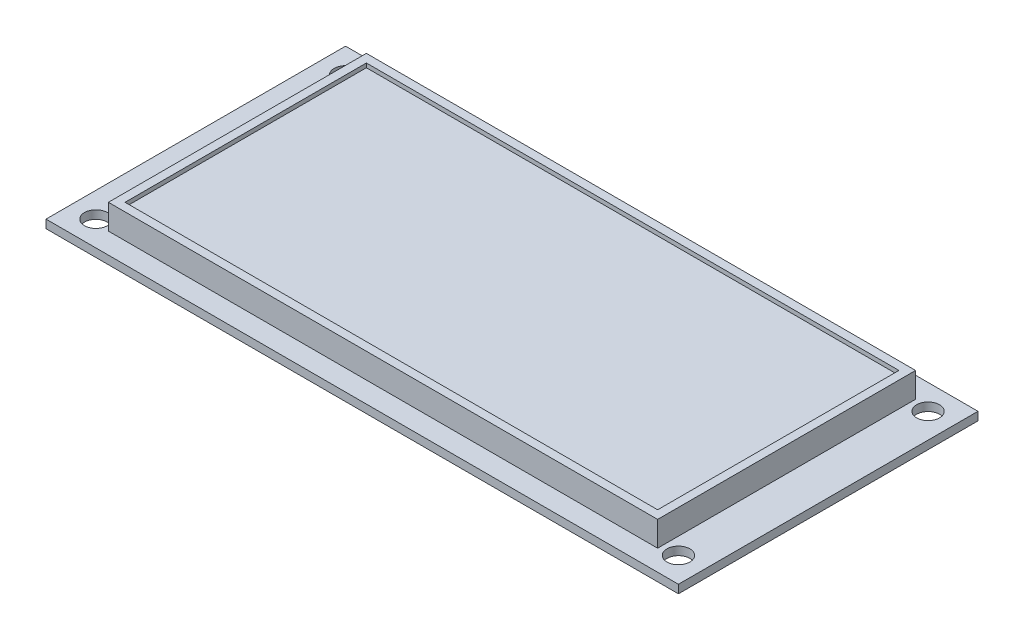
ISO-10303-21;
HEADER;
FILE_DESCRIPTION(('STEP AP214'),'2;1');
FILE_NAME('part.step','',(''),(''),'','','');
FILE_SCHEMA(('AUTOMOTIVE_DESIGN { 1 0 10303 214 1 1 1 1 }'));
ENDSEC;
DATA;
#1=APPLICATION_CONTEXT('core data for automotive mechanical design processes');
#2=APPLICATION_PROTOCOL_DEFINITION('international standard','automotive_design',2000,#1);
#3=PRODUCT_CONTEXT('',#1,'mechanical');
#4=PRODUCT('Part','Part','',(#3));
#5=PRODUCT_RELATED_PRODUCT_CATEGORY('part','',(#4));
#6=PRODUCT_DEFINITION_FORMATION('','',#4);
#7=PRODUCT_DEFINITION_CONTEXT('part definition',#1,'design');
#8=PRODUCT_DEFINITION('design','',#6,#7);
#9=PRODUCT_DEFINITION_SHAPE('','',#8);
#10=(LENGTH_UNIT() NAMED_UNIT(*) SI_UNIT(.MILLI.,.METRE.));
#11=(NAMED_UNIT(*) PLANE_ANGLE_UNIT() SI_UNIT($,.RADIAN.));
#12=(NAMED_UNIT(*) SI_UNIT($,.STERADIAN.) SOLID_ANGLE_UNIT());
#13=UNCERTAINTY_MEASURE_WITH_UNIT(LENGTH_MEASURE(1.E-05),#10,'distance_accuracy_value','');
#14=(GEOMETRIC_REPRESENTATION_CONTEXT(3) GLOBAL_UNCERTAINTY_ASSIGNED_CONTEXT((#13)) GLOBAL_UNIT_ASSIGNED_CONTEXT((#10,
#11,#12)) REPRESENTATION_CONTEXT('',''));
#15=CARTESIAN_POINT('',(0.,0.,0.));
#16=DIRECTION('',(0.,0.,1.));
#17=DIRECTION('',(1.,0.,0.));
#18=AXIS2_PLACEMENT_3D('',#15,#16,#17);
#19=CARTESIAN_POINT('',(0.,1.,0.));
#20=DIRECTION('',(0.,1.,0.));
#21=DIRECTION('',(0.,0.,1.));
#22=AXIS2_PLACEMENT_3D('',#19,#20,#21);
#23=PLANE('',#22);
#24=CARTESIAN_POINT('',(-35.,1.,15.));
#25=DIRECTION('',(0.,1.,0.));
#26=DIRECTION('',(0.,0.,1.));
#27=AXIS2_PLACEMENT_3D('',#24,#25,#26);
#28=CIRCLE('',#27,1.375);
#29=CARTESIAN_POINT('',(-35.,1.,16.375));
#30=VERTEX_POINT('',#29);
#31=EDGE_CURVE('E226',#30,#30,#28,.T.);
#32=ORIENTED_EDGE('',*,*,#31,.F.);
#33=EDGE_LOOP('',(#32));
#34=FACE_BOUND('',#33,.T.);
#35=CARTESIAN_POINT('',(35.,1.,15.));
#36=DIRECTION('',(0.,1.,0.));
#37=DIRECTION('',(0.,0.,-1.));
#38=AXIS2_PLACEMENT_3D('',#35,#36,#37);
#39=CIRCLE('',#38,1.375);
#40=CARTESIAN_POINT('',(35.,1.,13.625));
#41=VERTEX_POINT('',#40);
#42=EDGE_CURVE('E433',#41,#41,#39,.T.);
#43=ORIENTED_EDGE('',*,*,#42,.F.);
#44=EDGE_LOOP('',(#43));
#45=FACE_BOUND('',#44,.T.);
#46=CARTESIAN_POINT('',(35.,1.,-15.));
#47=DIRECTION('',(0.,1.,0.));
#48=DIRECTION('',(0.,0.,-1.));
#49=AXIS2_PLACEMENT_3D('',#46,#47,#48);
#50=CIRCLE('',#49,1.375);
#51=CARTESIAN_POINT('',(35.,1.,-16.375));
#52=VERTEX_POINT('',#51);
#53=EDGE_CURVE('E436',#52,#52,#50,.T.);
#54=ORIENTED_EDGE('',*,*,#53,.F.);
#55=EDGE_LOOP('',(#54));
#56=FACE_BOUND('',#55,.T.);
#57=CARTESIAN_POINT('',(-35.,1.,-15.));
#58=DIRECTION('',(0.,1.,0.));
#59=DIRECTION('',(0.,0.,1.));
#60=AXIS2_PLACEMENT_3D('',#57,#58,#59);
#61=CIRCLE('',#60,1.375);
#62=CARTESIAN_POINT('',(-35.,1.,-13.625));
#63=VERTEX_POINT('',#62);
#64=EDGE_CURVE('E152',#63,#63,#61,.T.);
#65=ORIENTED_EDGE('',*,*,#64,.F.);
#66=EDGE_LOOP('',(#65));
#67=FACE_BOUND('',#66,.T.);
#68=DIRECTION('',(0.,0.,-1.));
#69=VECTOR('',#68,1.);
#70=CARTESIAN_POINT('',(38.,1.,-18.));
#71=LINE('',#70,#69);
#72=CARTESIAN_POINT('',(38.,1.,18.));
#73=VERTEX_POINT('',#72);
#74=CARTESIAN_POINT('',(38.,1.,-18.));
#75=VERTEX_POINT('',#74);
#76=EDGE_CURVE('E196',#73,#75,#71,.T.);
#77=ORIENTED_EDGE('',*,*,#76,.T.);
#78=DIRECTION('',(-1.,0.,0.));
#79=VECTOR('',#78,1.);
#80=CARTESIAN_POINT('',(-38.,1.,-18.));
#81=LINE('',#80,#79);
#82=CARTESIAN_POINT('',(-38.,1.,-18.));
#83=VERTEX_POINT('',#82);
#84=EDGE_CURVE('E199',#75,#83,#81,.T.);
#85=ORIENTED_EDGE('',*,*,#84,.T.);
#86=DIRECTION('',(0.,0.,1.));
#87=VECTOR('',#86,1.);
#88=CARTESIAN_POINT('',(-38.,1.,-18.));
#89=LINE('',#88,#87);
#90=CARTESIAN_POINT('',(-38.,1.,18.));
#91=VERTEX_POINT('',#90);
#92=EDGE_CURVE('E202',#83,#91,#89,.T.);
#93=ORIENTED_EDGE('',*,*,#92,.T.);
#94=DIRECTION('',(1.,0.,0.));
#95=VECTOR('',#94,1.);
#96=CARTESIAN_POINT('',(-38.,1.,18.));
#97=LINE('',#96,#95);
#98=EDGE_CURVE('E204',#91,#73,#97,.T.);
#99=ORIENTED_EDGE('',*,*,#98,.T.);
#100=EDGE_LOOP('',(#77,#85,#93,#99));
#101=FACE_BOUND('',#100,.T.);
#102=DIRECTION('',(-1.,0.,0.));
#103=VECTOR('',#102,1.);
#104=CARTESIAN_POINT('',(-33.,1.,-15.5));
#105=LINE('',#104,#103);
#106=CARTESIAN_POINT('',(33.,1.,-15.5));
#107=VERTEX_POINT('',#106);
#108=CARTESIAN_POINT('',(-33.,1.,-15.5));
#109=VERTEX_POINT('',#108);
#110=EDGE_CURVE('E182',#107,#109,#105,.T.);
#111=ORIENTED_EDGE('',*,*,#110,.F.);
#112=DIRECTION('',(0.,0.,-1.));
#113=VECTOR('',#112,1.);
#114=CARTESIAN_POINT('',(33.,1.,-15.5));
#115=LINE('',#114,#113);
#116=CARTESIAN_POINT('',(33.,1.,15.5));
#117=VERTEX_POINT('',#116);
#118=EDGE_CURVE('E165',#117,#107,#115,.T.);
#119=ORIENTED_EDGE('',*,*,#118,.F.);
#120=DIRECTION('',(1.,0.,0.));
#121=VECTOR('',#120,1.);
#122=CARTESIAN_POINT('',(-33.,1.,15.5));
#123=LINE('',#122,#121);
#124=CARTESIAN_POINT('',(-33.,1.,15.5));
#125=VERTEX_POINT('',#124);
#126=EDGE_CURVE('E173',#125,#117,#123,.T.);
#127=ORIENTED_EDGE('',*,*,#126,.F.);
#128=DIRECTION('',(0.,0.,1.));
#129=VECTOR('',#128,1.);
#130=CARTESIAN_POINT('',(-33.,1.,-15.5));
#131=LINE('',#130,#129);
#132=EDGE_CURVE('E184',#109,#125,#131,.T.);
#133=ORIENTED_EDGE('',*,*,#132,.F.);
#134=EDGE_LOOP('',(#111,#119,#127,#133));
#135=FACE_BOUND('',#134,.T.);
#136=ADVANCED_FACE('F34',(#34,#45,#56,#67,#101,#135),#23,.T.);
#137=CARTESIAN_POINT('',(38.,1.,-18.));
#138=DIRECTION('',(-1.,0.,0.));
#139=DIRECTION('',(0.,0.,1.));
#140=AXIS2_PLACEMENT_3D('',#137,#138,#139);
#141=PLANE('',#140);
#142=DIRECTION('',(0.,0.,-1.));
#143=VECTOR('',#142,1.);
#144=CARTESIAN_POINT('',(38.,0.,-18.));
#145=LINE('',#144,#143);
#146=CARTESIAN_POINT('',(38.,0.,18.));
#147=VERTEX_POINT('',#146);
#148=CARTESIAN_POINT('',(38.,0.,-18.));
#149=VERTEX_POINT('',#148);
#150=EDGE_CURVE('E195',#147,#149,#145,.T.);
#151=ORIENTED_EDGE('',*,*,#150,.T.);
#152=DIRECTION('',(0.,-1.,0.));
#153=VECTOR('',#152,1.);
#154=CARTESIAN_POINT('',(38.,1.,-18.));
#155=LINE('',#154,#153);
#156=EDGE_CURVE('E11',#75,#149,#155,.T.);
#157=ORIENTED_EDGE('',*,*,#156,.F.);
#158=ORIENTED_EDGE('',*,*,#76,.F.);
#159=DIRECTION('',(0.,-1.,0.));
#160=VECTOR('',#159,1.);
#161=CARTESIAN_POINT('',(38.,1.,18.));
#162=LINE('',#161,#160);
#163=EDGE_CURVE('E206',#73,#147,#162,.T.);
#164=ORIENTED_EDGE('',*,*,#163,.T.);
#165=EDGE_LOOP('',(#151,#157,#158,#164));
#166=FACE_BOUND('',#165,.T.);
#167=ADVANCED_FACE('F36',(#166),#141,.F.);
#168=CARTESIAN_POINT('',(-38.,1.,-18.));
#169=DIRECTION('',(0.,0.,1.));
#170=DIRECTION('',(1.,0.,0.));
#171=AXIS2_PLACEMENT_3D('',#168,#169,#170);
#172=PLANE('',#171);
#173=DIRECTION('',(-1.,0.,0.));
#174=VECTOR('',#173,1.);
#175=CARTESIAN_POINT('',(-38.,0.,-18.));
#176=LINE('',#175,#174);
#177=CARTESIAN_POINT('',(-38.,0.,-18.));
#178=VERTEX_POINT('',#177);
#179=EDGE_CURVE('E209',#149,#178,#176,.T.);
#180=ORIENTED_EDGE('',*,*,#179,.T.);
#181=DIRECTION('',(0.,-1.,0.));
#182=VECTOR('',#181,1.);
#183=CARTESIAN_POINT('',(-38.,1.,-18.));
#184=LINE('',#183,#182);
#185=EDGE_CURVE('E43',#83,#178,#184,.T.);
#186=ORIENTED_EDGE('',*,*,#185,.F.);
#187=ORIENTED_EDGE('',*,*,#84,.F.);
#188=ORIENTED_EDGE('',*,*,#156,.T.);
#189=EDGE_LOOP('',(#180,#186,#187,#188));
#190=FACE_BOUND('',#189,.T.);
#191=ADVANCED_FACE('F288',(#190),#172,.F.);
#192=CARTESIAN_POINT('',(-38.,1.,-18.));
#193=DIRECTION('',(1.,0.,0.));
#194=DIRECTION('',(0.,0.,-1.));
#195=AXIS2_PLACEMENT_3D('',#192,#193,#194);
#196=PLANE('',#195);
#197=DIRECTION('',(0.,0.,1.));
#198=VECTOR('',#197,1.);
#199=CARTESIAN_POINT('',(-38.,0.,-18.));
#200=LINE('',#199,#198);
#201=CARTESIAN_POINT('',(-38.,0.,18.));
#202=VERTEX_POINT('',#201);
#203=EDGE_CURVE('E211',#178,#202,#200,.T.);
#204=ORIENTED_EDGE('',*,*,#203,.T.);
#205=DIRECTION('',(0.,-1.,0.));
#206=VECTOR('',#205,1.);
#207=CARTESIAN_POINT('',(-38.,1.,18.));
#208=LINE('',#207,#206);
#209=EDGE_CURVE('E216',#91,#202,#208,.T.);
#210=ORIENTED_EDGE('',*,*,#209,.F.);
#211=ORIENTED_EDGE('',*,*,#92,.F.);
#212=ORIENTED_EDGE('',*,*,#185,.T.);
#213=EDGE_LOOP('',(#204,#210,#211,#212));
#214=FACE_BOUND('',#213,.T.);
#215=ADVANCED_FACE('F285',(#214),#196,.F.);
#216=CARTESIAN_POINT('',(-38.,1.,18.));
#217=DIRECTION('',(0.,0.,-1.));
#218=DIRECTION('',(-1.,0.,0.));
#219=AXIS2_PLACEMENT_3D('',#216,#217,#218);
#220=PLANE('',#219);
#221=DIRECTION('',(1.,0.,0.));
#222=VECTOR('',#221,1.);
#223=CARTESIAN_POINT('',(-38.,0.,18.));
#224=LINE('',#223,#222);
#225=EDGE_CURVE('E200',#202,#147,#224,.T.);
#226=ORIENTED_EDGE('',*,*,#225,.T.);
#227=ORIENTED_EDGE('',*,*,#163,.F.);
#228=ORIENTED_EDGE('',*,*,#98,.F.);
#229=ORIENTED_EDGE('',*,*,#209,.T.);
#230=EDGE_LOOP('',(#226,#227,#228,#229));
#231=FACE_BOUND('',#230,.T.);
#232=ADVANCED_FACE('F282',(#231),#220,.F.);
#233=CARTESIAN_POINT('',(0.,0.,0.));
#234=DIRECTION('',(0.,1.,0.));
#235=DIRECTION('',(0.,0.,1.));
#236=AXIS2_PLACEMENT_3D('',#233,#234,#235);
#237=PLANE('',#236);
#238=CARTESIAN_POINT('',(-35.,0.,15.));
#239=DIRECTION('',(0.,1.,0.));
#240=DIRECTION('',(0.,0.,1.));
#241=AXIS2_PLACEMENT_3D('',#238,#239,#240);
#242=CIRCLE('',#241,1.375);
#243=CARTESIAN_POINT('',(-35.,0.,16.375));
#244=VERTEX_POINT('',#243);
#245=EDGE_CURVE('E38',#244,#244,#242,.T.);
#246=ORIENTED_EDGE('',*,*,#245,.T.);
#247=EDGE_LOOP('',(#246));
#248=FACE_BOUND('',#247,.T.);
#249=CARTESIAN_POINT('',(35.,0.,15.));
#250=DIRECTION('',(0.,1.,0.));
#251=DIRECTION('',(0.,0.,1.));
#252=AXIS2_PLACEMENT_3D('',#249,#250,#251);
#253=CIRCLE('',#252,1.375);
#254=CARTESIAN_POINT('',(35.,0.,16.375));
#255=VERTEX_POINT('',#254);
#256=EDGE_CURVE('E225',#255,#255,#253,.T.);
#257=ORIENTED_EDGE('',*,*,#256,.T.);
#258=EDGE_LOOP('',(#257));
#259=FACE_BOUND('',#258,.T.);
#260=CARTESIAN_POINT('',(35.,0.,-15.));
#261=DIRECTION('',(0.,1.,0.));
#262=DIRECTION('',(0.,0.,1.));
#263=AXIS2_PLACEMENT_3D('',#260,#261,#262);
#264=CIRCLE('',#263,1.375);
#265=CARTESIAN_POINT('',(35.,0.,-13.625));
#266=VERTEX_POINT('',#265);
#267=EDGE_CURVE('E223',#266,#266,#264,.T.);
#268=ORIENTED_EDGE('',*,*,#267,.T.);
#269=EDGE_LOOP('',(#268));
#270=FACE_BOUND('',#269,.T.);
#271=CARTESIAN_POINT('',(-35.,0.,-15.));
#272=DIRECTION('',(0.,1.,0.));
#273=DIRECTION('',(0.,0.,1.));
#274=AXIS2_PLACEMENT_3D('',#271,#272,#273);
#275=CIRCLE('',#274,1.375);
#276=CARTESIAN_POINT('',(-35.,0.,-13.625));
#277=VERTEX_POINT('',#276);
#278=EDGE_CURVE('E159',#277,#277,#275,.T.);
#279=ORIENTED_EDGE('',*,*,#278,.T.);
#280=EDGE_LOOP('',(#279));
#281=FACE_BOUND('',#280,.T.);
#282=ORIENTED_EDGE('',*,*,#150,.F.);
#283=ORIENTED_EDGE('',*,*,#225,.F.);
#284=ORIENTED_EDGE('',*,*,#203,.F.);
#285=ORIENTED_EDGE('',*,*,#179,.F.);
#286=EDGE_LOOP('',(#282,#283,#284,#285));
#287=FACE_BOUND('',#286,.T.);
#288=ADVANCED_FACE('F278',(#248,#259,#270,#281,#287),#237,.F.);
#289=CARTESIAN_POINT('',(33.,4.,-15.5));
#290=DIRECTION('',(-1.,0.,0.));
#291=DIRECTION('',(0.,0.,1.));
#292=AXIS2_PLACEMENT_3D('',#289,#290,#291);
#293=PLANE('',#292);
#294=ORIENTED_EDGE('',*,*,#118,.T.);
#295=DIRECTION('',(0.,-1.,0.));
#296=VECTOR('',#295,1.);
#297=CARTESIAN_POINT('',(33.,4.,-15.5));
#298=LINE('',#297,#296);
#299=CARTESIAN_POINT('',(33.,4.,-15.5));
#300=VERTEX_POINT('',#299);
#301=EDGE_CURVE('E193',#300,#107,#298,.T.);
#302=ORIENTED_EDGE('',*,*,#301,.F.);
#303=DIRECTION('',(0.,0.,-1.));
#304=VECTOR('',#303,1.);
#305=CARTESIAN_POINT('',(33.,4.,-15.5));
#306=LINE('',#305,#304);
#307=CARTESIAN_POINT('',(33.,4.,15.5));
#308=VERTEX_POINT('',#307);
#309=EDGE_CURVE('E169',#308,#300,#306,.T.);
#310=ORIENTED_EDGE('',*,*,#309,.F.);
#311=DIRECTION('',(0.,-1.,0.));
#312=VECTOR('',#311,1.);
#313=CARTESIAN_POINT('',(33.,4.,15.5));
#314=LINE('',#313,#312);
#315=EDGE_CURVE('E179',#308,#117,#314,.T.);
#316=ORIENTED_EDGE('',*,*,#315,.T.);
#317=EDGE_LOOP('',(#294,#302,#310,#316));
#318=FACE_BOUND('',#317,.T.);
#319=ADVANCED_FACE('F262',(#318),#293,.F.);
#320=CARTESIAN_POINT('',(-33.,4.,-15.5));
#321=DIRECTION('',(0.,0.,1.));
#322=DIRECTION('',(1.,0.,0.));
#323=AXIS2_PLACEMENT_3D('',#320,#321,#322);
#324=PLANE('',#323);
#325=ORIENTED_EDGE('',*,*,#110,.T.);
#326=DIRECTION('',(0.,-1.,0.));
#327=VECTOR('',#326,1.);
#328=CARTESIAN_POINT('',(-33.,4.,-15.5));
#329=LINE('',#328,#327);
#330=CARTESIAN_POINT('',(-33.,4.,-15.5));
#331=VERTEX_POINT('',#330);
#332=EDGE_CURVE('E190',#331,#109,#329,.T.);
#333=ORIENTED_EDGE('',*,*,#332,.F.);
#334=DIRECTION('',(-1.,0.,0.));
#335=VECTOR('',#334,1.);
#336=CARTESIAN_POINT('',(-33.,4.,-15.5));
#337=LINE('',#336,#335);
#338=EDGE_CURVE('E172',#300,#331,#337,.T.);
#339=ORIENTED_EDGE('',*,*,#338,.F.);
#340=ORIENTED_EDGE('',*,*,#301,.T.);
#341=EDGE_LOOP('',(#325,#333,#339,#340));
#342=FACE_BOUND('',#341,.T.);
#343=ADVANCED_FACE('F252',(#342),#324,.F.);
#344=CARTESIAN_POINT('',(-33.,4.,-15.5));
#345=DIRECTION('',(1.,0.,0.));
#346=DIRECTION('',(0.,0.,-1.));
#347=AXIS2_PLACEMENT_3D('',#344,#345,#346);
#348=PLANE('',#347);
#349=ORIENTED_EDGE('',*,*,#132,.T.);
#350=DIRECTION('',(0.,-1.,0.));
#351=VECTOR('',#350,1.);
#352=CARTESIAN_POINT('',(-33.,4.,15.5));
#353=LINE('',#352,#351);
#354=CARTESIAN_POINT('',(-33.,4.,15.5));
#355=VERTEX_POINT('',#354);
#356=EDGE_CURVE('E59',#355,#125,#353,.T.);
#357=ORIENTED_EDGE('',*,*,#356,.F.);
#358=DIRECTION('',(0.,0.,1.));
#359=VECTOR('',#358,1.);
#360=CARTESIAN_POINT('',(-33.,4.,-15.5));
#361=LINE('',#360,#359);
#362=EDGE_CURVE('E175',#331,#355,#361,.T.);
#363=ORIENTED_EDGE('',*,*,#362,.F.);
#364=ORIENTED_EDGE('',*,*,#332,.T.);
#365=EDGE_LOOP('',(#349,#357,#363,#364));
#366=FACE_BOUND('',#365,.T.);
#367=ADVANCED_FACE('F256',(#366),#348,.F.);
#368=CARTESIAN_POINT('',(-33.,4.,15.5));
#369=DIRECTION('',(0.,0.,-1.));
#370=DIRECTION('',(-1.,0.,0.));
#371=AXIS2_PLACEMENT_3D('',#368,#369,#370);
#372=PLANE('',#371);
#373=ORIENTED_EDGE('',*,*,#126,.T.);
#374=ORIENTED_EDGE('',*,*,#315,.F.);
#375=DIRECTION('',(1.,0.,0.));
#376=VECTOR('',#375,1.);
#377=CARTESIAN_POINT('',(-33.,4.,15.5));
#378=LINE('',#377,#376);
#379=EDGE_CURVE('E177',#355,#308,#378,.T.);
#380=ORIENTED_EDGE('',*,*,#379,.F.);
#381=ORIENTED_EDGE('',*,*,#356,.T.);
#382=EDGE_LOOP('',(#373,#374,#380,#381));
#383=FACE_BOUND('',#382,.T.);
#384=ADVANCED_FACE('F263',(#383),#372,.F.);
#385=CARTESIAN_POINT('',(0.,4.,0.));
#386=DIRECTION('',(0.,1.,0.));
#387=DIRECTION('',(0.,0.,1.));
#388=AXIS2_PLACEMENT_3D('',#385,#386,#387);
#389=PLANE('',#388);
#390=DIRECTION('',(0.,0.,-1.));
#391=VECTOR('',#390,1.);
#392=CARTESIAN_POINT('',(32.,4.,-14.5));
#393=LINE('',#392,#391);
#394=CARTESIAN_POINT('',(32.,4.,14.5));
#395=VERTEX_POINT('',#394);
#396=CARTESIAN_POINT('',(32.,4.,-14.5));
#397=VERTEX_POINT('',#396);
#398=EDGE_CURVE('E51',#395,#397,#393,.T.);
#399=ORIENTED_EDGE('',*,*,#398,.F.);
#400=DIRECTION('',(1.,0.,0.));
#401=VECTOR('',#400,1.);
#402=CARTESIAN_POINT('',(-32.,4.,14.5));
#403=LINE('',#402,#401);
#404=CARTESIAN_POINT('',(-32.,4.,14.5));
#405=VERTEX_POINT('',#404);
#406=EDGE_CURVE('E146',#405,#395,#403,.T.);
#407=ORIENTED_EDGE('',*,*,#406,.F.);
#408=DIRECTION('',(0.,0.,1.));
#409=VECTOR('',#408,1.);
#410=CARTESIAN_POINT('',(-32.,4.,-14.5));
#411=LINE('',#410,#409);
#412=CARTESIAN_POINT('',(-32.,4.,-14.5));
#413=VERTEX_POINT('',#412);
#414=EDGE_CURVE('E149',#413,#405,#411,.T.);
#415=ORIENTED_EDGE('',*,*,#414,.F.);
#416=DIRECTION('',(-1.,0.,0.));
#417=VECTOR('',#416,1.);
#418=CARTESIAN_POINT('',(-32.,4.,-14.5));
#419=LINE('',#418,#417);
#420=EDGE_CURVE('E158',#397,#413,#419,.T.);
#421=ORIENTED_EDGE('',*,*,#420,.F.);
#422=EDGE_LOOP('',(#399,#407,#415,#421));
#423=FACE_BOUND('',#422,.T.);
#424=ORIENTED_EDGE('',*,*,#309,.T.);
#425=ORIENTED_EDGE('',*,*,#338,.T.);
#426=ORIENTED_EDGE('',*,*,#362,.T.);
#427=ORIENTED_EDGE('',*,*,#379,.T.);
#428=EDGE_LOOP('',(#424,#425,#426,#427));
#429=FACE_BOUND('',#428,.T.);
#430=ADVANCED_FACE('F258',(#423,#429),#389,.T.);
#431=CARTESIAN_POINT('',(32.,3.5,-14.5));
#432=DIRECTION('',(1.,0.,0.));
#433=DIRECTION('',(0.,0.,-1.));
#434=AXIS2_PLACEMENT_3D('',#431,#432,#433);
#435=PLANE('',#434);
#436=ORIENTED_EDGE('',*,*,#398,.T.);
#437=DIRECTION('',(0.,1.,0.));
#438=VECTOR('',#437,1.);
#439=CARTESIAN_POINT('',(32.,3.5,-14.5));
#440=LINE('',#439,#438);
#441=CARTESIAN_POINT('',(32.,3.5,-14.5));
#442=VERTEX_POINT('',#441);
#443=EDGE_CURVE('E124',#442,#397,#440,.T.);
#444=ORIENTED_EDGE('',*,*,#443,.F.);
#445=DIRECTION('',(0.,0.,-1.));
#446=VECTOR('',#445,1.);
#447=CARTESIAN_POINT('',(32.,3.5,-14.5));
#448=LINE('',#447,#446);
#449=CARTESIAN_POINT('',(32.,3.5,14.5));
#450=VERTEX_POINT('',#449);
#451=EDGE_CURVE('E128',#450,#442,#448,.T.);
#452=ORIENTED_EDGE('',*,*,#451,.F.);
#453=DIRECTION('',(0.,1.,0.));
#454=VECTOR('',#453,1.);
#455=CARTESIAN_POINT('',(32.,3.5,14.5));
#456=LINE('',#455,#454);
#457=EDGE_CURVE('E163',#450,#395,#456,.T.);
#458=ORIENTED_EDGE('',*,*,#457,.T.);
#459=EDGE_LOOP('',(#436,#444,#452,#458));
#460=FACE_BOUND('',#459,.T.);
#461=ADVANCED_FACE('F126',(#460),#435,.F.);
#462=CARTESIAN_POINT('',(-32.,3.5,14.5));
#463=DIRECTION('',(0.,0.,1.));
#464=DIRECTION('',(1.,0.,0.));
#465=AXIS2_PLACEMENT_3D('',#462,#463,#464);
#466=PLANE('',#465);
#467=ORIENTED_EDGE('',*,*,#406,.T.);
#468=ORIENTED_EDGE('',*,*,#457,.F.);
#469=DIRECTION('',(1.,0.,0.));
#470=VECTOR('',#469,1.);
#471=CARTESIAN_POINT('',(-32.,3.5,14.5));
#472=LINE('',#471,#470);
#473=CARTESIAN_POINT('',(-32.,3.5,14.5));
#474=VERTEX_POINT('',#473);
#475=EDGE_CURVE('E134',#474,#450,#472,.T.);
#476=ORIENTED_EDGE('',*,*,#475,.F.);
#477=DIRECTION('',(0.,1.,0.));
#478=VECTOR('',#477,1.);
#479=CARTESIAN_POINT('',(-32.,3.5,14.5));
#480=LINE('',#479,#478);
#481=EDGE_CURVE('E166',#474,#405,#480,.T.);
#482=ORIENTED_EDGE('',*,*,#481,.T.);
#483=EDGE_LOOP('',(#467,#468,#476,#482));
#484=FACE_BOUND('',#483,.T.);
#485=ADVANCED_FACE('F357',(#484),#466,.F.);
#486=CARTESIAN_POINT('',(-32.,3.5,-14.5));
#487=DIRECTION('',(-1.,0.,0.));
#488=DIRECTION('',(0.,0.,1.));
#489=AXIS2_PLACEMENT_3D('',#486,#487,#488);
#490=PLANE('',#489);
#491=ORIENTED_EDGE('',*,*,#414,.T.);
#492=ORIENTED_EDGE('',*,*,#481,.F.);
#493=DIRECTION('',(0.,0.,1.));
#494=VECTOR('',#493,1.);
#495=CARTESIAN_POINT('',(-32.,3.5,-14.5));
#496=LINE('',#495,#494);
#497=CARTESIAN_POINT('',(-32.,3.5,-14.5));
#498=VERTEX_POINT('',#497);
#499=EDGE_CURVE('E142',#498,#474,#496,.T.);
#500=ORIENTED_EDGE('',*,*,#499,.F.);
#501=DIRECTION('',(0.,1.,0.));
#502=VECTOR('',#501,1.);
#503=CARTESIAN_POINT('',(-32.,3.5,-14.5));
#504=LINE('',#503,#502);
#505=EDGE_CURVE('E133',#498,#413,#504,.T.);
#506=ORIENTED_EDGE('',*,*,#505,.T.);
#507=EDGE_LOOP('',(#491,#492,#500,#506));
#508=FACE_BOUND('',#507,.T.);
#509=ADVANCED_FACE('F365',(#508),#490,.F.);
#510=CARTESIAN_POINT('',(-32.,3.5,-14.5));
#511=DIRECTION('',(0.,0.,-1.));
#512=DIRECTION('',(-1.,0.,0.));
#513=AXIS2_PLACEMENT_3D('',#510,#511,#512);
#514=PLANE('',#513);
#515=ORIENTED_EDGE('',*,*,#420,.T.);
#516=ORIENTED_EDGE('',*,*,#505,.F.);
#517=DIRECTION('',(-1.,0.,0.));
#518=VECTOR('',#517,1.);
#519=CARTESIAN_POINT('',(-32.,3.5,-14.5));
#520=LINE('',#519,#518);
#521=EDGE_CURVE('E137',#442,#498,#520,.T.);
#522=ORIENTED_EDGE('',*,*,#521,.F.);
#523=ORIENTED_EDGE('',*,*,#443,.T.);
#524=EDGE_LOOP('',(#515,#516,#522,#523));
#525=FACE_BOUND('',#524,.T.);
#526=ADVANCED_FACE('F138',(#525),#514,.F.);
#527=CARTESIAN_POINT('',(0.,3.5,0.));
#528=DIRECTION('',(0.,1.,0.));
#529=DIRECTION('',(0.,0.,1.));
#530=AXIS2_PLACEMENT_3D('',#527,#528,#529);
#531=PLANE('',#530);
#532=ORIENTED_EDGE('',*,*,#451,.T.);
#533=ORIENTED_EDGE('',*,*,#521,.T.);
#534=ORIENTED_EDGE('',*,*,#499,.T.);
#535=ORIENTED_EDGE('',*,*,#475,.T.);
#536=EDGE_LOOP('',(#532,#533,#534,#535));
#537=FACE_BOUND('',#536,.T.);
#538=ADVANCED_FACE('F144',(#537),#531,.T.);
#539=CARTESIAN_POINT('',(-35.,-4.,-15.));
#540=DIRECTION('',(0.,1.,0.));
#541=DIRECTION('',(0.,0.,1.));
#542=AXIS2_PLACEMENT_3D('',#539,#540,#541);
#543=CYLINDRICAL_SURFACE('',#542,1.375);
#544=ORIENTED_EDGE('',*,*,#64,.T.);
#545=EDGE_LOOP('',(#544));
#546=FACE_BOUND('',#545,.T.);
#547=ORIENTED_EDGE('',*,*,#278,.F.);
#548=EDGE_LOOP('',(#547));
#549=FACE_BOUND('',#548,.T.);
#550=ADVANCED_FACE('F236',(#546,#549),#543,.F.);
#551=CARTESIAN_POINT('',(35.,-4.,-15.));
#552=DIRECTION('',(0.,1.,0.));
#553=DIRECTION('',(0.,0.,1.));
#554=AXIS2_PLACEMENT_3D('',#551,#552,#553);
#555=CYLINDRICAL_SURFACE('',#554,1.375);
#556=ORIENTED_EDGE('',*,*,#53,.T.);
#557=EDGE_LOOP('',(#556));
#558=FACE_BOUND('',#557,.T.);
#559=ORIENTED_EDGE('',*,*,#267,.F.);
#560=EDGE_LOOP('',(#559));
#561=FACE_BOUND('',#560,.T.);
#562=ADVANCED_FACE('F397',(#558,#561),#555,.F.);
#563=CARTESIAN_POINT('',(35.,-4.,15.));
#564=DIRECTION('',(0.,1.,0.));
#565=DIRECTION('',(0.,0.,1.));
#566=AXIS2_PLACEMENT_3D('',#563,#564,#565);
#567=CYLINDRICAL_SURFACE('',#566,1.375);
#568=ORIENTED_EDGE('',*,*,#42,.T.);
#569=EDGE_LOOP('',(#568));
#570=FACE_BOUND('',#569,.T.);
#571=ORIENTED_EDGE('',*,*,#256,.F.);
#572=EDGE_LOOP('',(#571));
#573=FACE_BOUND('',#572,.T.);
#574=ADVANCED_FACE('F405',(#570,#573),#567,.F.);
#575=CARTESIAN_POINT('',(-35.,-4.,15.));
#576=DIRECTION('',(0.,1.,0.));
#577=DIRECTION('',(0.,0.,1.));
#578=AXIS2_PLACEMENT_3D('',#575,#576,#577);
#579=CYLINDRICAL_SURFACE('',#578,1.375);
#580=ORIENTED_EDGE('',*,*,#31,.T.);
#581=EDGE_LOOP('',(#580));
#582=FACE_BOUND('',#581,.T.);
#583=ORIENTED_EDGE('',*,*,#245,.F.);
#584=EDGE_LOOP('',(#583));
#585=FACE_BOUND('',#584,.T.);
#586=ADVANCED_FACE('F414',(#582,#585),#579,.F.);
#587=CLOSED_SHELL('',(#136,#167,#191,#215,#232,#288,#319,#343,#367,#384,#430,#461,#485,#509,
#526,#538,#550,#562,#574,#586));
#588=MANIFOLD_SOLID_BREP('B2',#587);
#589=ADVANCED_BREP_SHAPE_REPRESENTATION('',(#18,#588),#14);
#590=SHAPE_DEFINITION_REPRESENTATION(#9,#589);
ENDSEC;
END-ISO-10303-21;
